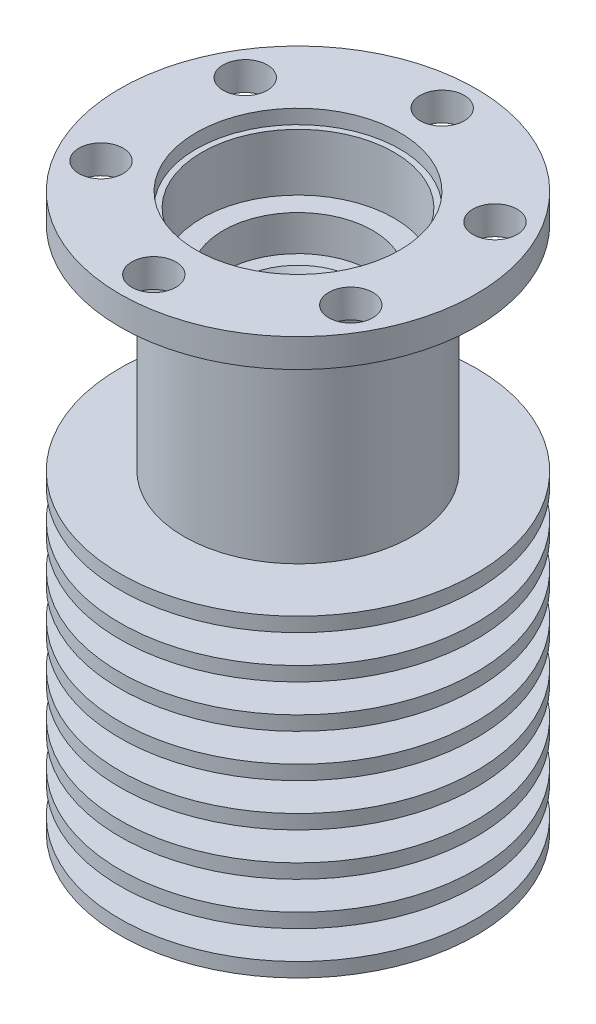
ISO-10303-21;
HEADER;
FILE_DESCRIPTION(('STEP AP214'),'2;1');
FILE_NAME('part.step','',(''),(''),'','','');
FILE_SCHEMA(('AUTOMOTIVE_DESIGN { 1 0 10303 214 1 1 1 1 }'));
ENDSEC;
DATA;
#1=APPLICATION_CONTEXT('core data for automotive mechanical design processes');
#2=APPLICATION_PROTOCOL_DEFINITION('international standard','automotive_design',2000,#1);
#3=PRODUCT_CONTEXT('',#1,'mechanical');
#4=PRODUCT('Part','Part','',(#3));
#5=PRODUCT_RELATED_PRODUCT_CATEGORY('part','',(#4));
#6=PRODUCT_DEFINITION_FORMATION('','',#4);
#7=PRODUCT_DEFINITION_CONTEXT('part definition',#1,'design');
#8=PRODUCT_DEFINITION('design','',#6,#7);
#9=PRODUCT_DEFINITION_SHAPE('','',#8);
#10=(LENGTH_UNIT() NAMED_UNIT(*) SI_UNIT(.MILLI.,.METRE.));
#11=(NAMED_UNIT(*) PLANE_ANGLE_UNIT() SI_UNIT($,.RADIAN.));
#12=(NAMED_UNIT(*) SI_UNIT($,.STERADIAN.) SOLID_ANGLE_UNIT());
#13=UNCERTAINTY_MEASURE_WITH_UNIT(LENGTH_MEASURE(1.E-05),#10,'distance_accuracy_value','');
#14=(GEOMETRIC_REPRESENTATION_CONTEXT(3) GLOBAL_UNCERTAINTY_ASSIGNED_CONTEXT((#13)) GLOBAL_UNIT_ASSIGNED_CONTEXT((#10,
#11,#12)) REPRESENTATION_CONTEXT('',''));
#15=CARTESIAN_POINT('',(0.,0.,0.));
#16=DIRECTION('',(0.,0.,1.));
#17=DIRECTION('',(1.,0.,0.));
#18=AXIS2_PLACEMENT_3D('',#15,#16,#17);
#19=CARTESIAN_POINT('',(0.,0.,0.));
#20=DIRECTION('',(0.,-1.,0.));
#21=DIRECTION('',(0.,0.,-1.));
#22=AXIS2_PLACEMENT_3D('',#19,#20,#21);
#23=CYLINDRICAL_SURFACE('',#22,6.75);
#24=CARTESIAN_POINT('',(0.,34.,0.));
#25=DIRECTION('',(0.,-1.,0.));
#26=DIRECTION('',(0.,0.,-1.));
#27=AXIS2_PLACEMENT_3D('',#24,#25,#26);
#28=CIRCLE('',#27,6.75);
#29=CARTESIAN_POINT('',(0.,34.,-6.75));
#30=VERTEX_POINT('',#29);
#31=EDGE_CURVE('E121',#30,#30,#28,.T.);
#32=ORIENTED_EDGE('',*,*,#31,.T.);
#33=EDGE_LOOP('',(#32));
#34=FACE_BOUND('',#33,.T.);
#35=CARTESIAN_POINT('',(0.,38.,0.));
#36=DIRECTION('',(0.,1.,0.));
#37=DIRECTION('',(-1.,0.,0.));
#38=AXIS2_PLACEMENT_3D('',#35,#36,#37);
#39=CIRCLE('',#38,6.75);
#40=CARTESIAN_POINT('',(-6.75,38.,0.));
#41=VERTEX_POINT('',#40);
#42=EDGE_CURVE('E57',#41,#41,#39,.F.);
#43=ORIENTED_EDGE('',*,*,#42,.F.);
#44=EDGE_LOOP('',(#43));
#45=FACE_BOUND('',#44,.T.);
#46=ADVANCED_FACE('F36',(#34,#45),#23,.F.);
#47=CARTESIAN_POINT('',(0.,39.,0.));
#48=DIRECTION('',(0.,1.,0.));
#49=DIRECTION('',(0.,0.,1.));
#50=AXIS2_PLACEMENT_3D('',#47,#48,#49);
#51=CYLINDRICAL_SURFACE('',#50,4.75);
#52=CARTESIAN_POINT('',(0.,21.,0.));
#53=DIRECTION('',(0.,-1.,0.));
#54=DIRECTION('',(0.,0.,-1.));
#55=AXIS2_PLACEMENT_3D('',#52,#53,#54);
#56=CIRCLE('',#55,4.75);
#57=CARTESIAN_POINT('',(0.,21.,-4.75));
#58=VERTEX_POINT('',#57);
#59=EDGE_CURVE('E178',#58,#58,#56,.T.);
#60=ORIENTED_EDGE('',*,*,#59,.T.);
#61=EDGE_LOOP('',(#60));
#62=FACE_BOUND('',#61,.T.);
#63=CARTESIAN_POINT('',(0.,19.,0.));
#64=DIRECTION('',(0.,-1.,0.));
#65=DIRECTION('',(0.,0.,-1.));
#66=AXIS2_PLACEMENT_3D('',#63,#64,#65);
#67=CIRCLE('',#66,4.75);
#68=CARTESIAN_POINT('',(0.,19.,-4.75));
#69=VERTEX_POINT('',#68);
#70=EDGE_CURVE('E67',#69,#69,#67,.T.);
#71=ORIENTED_EDGE('',*,*,#70,.F.);
#72=EDGE_LOOP('',(#71));
#73=FACE_BOUND('',#72,.T.);
#74=ADVANCED_FACE('F296',(#62,#73),#51,.T.);
#75=CARTESIAN_POINT('',(0.,18.,0.));
#76=DIRECTION('',(0.,-1.,0.));
#77=DIRECTION('',(0.,0.,-1.));
#78=AXIS2_PLACEMENT_3D('',#75,#76,#77);
#79=CIRCLE('',#78,4.75);
#80=CARTESIAN_POINT('',(0.,18.,-4.75));
#81=VERTEX_POINT('',#80);
#82=EDGE_CURVE('E162',#81,#81,#79,.T.);
#83=ORIENTED_EDGE('',*,*,#82,.T.);
#84=EDGE_LOOP('',(#83));
#85=FACE_BOUND('',#84,.T.);
#86=CARTESIAN_POINT('',(0.,16.,0.));
#87=DIRECTION('',(0.,-1.,0.));
#88=DIRECTION('',(0.,0.,-1.));
#89=AXIS2_PLACEMENT_3D('',#86,#87,#88);
#90=CIRCLE('',#89,4.75);
#91=CARTESIAN_POINT('',(0.,16.,-4.75));
#92=VERTEX_POINT('',#91);
#93=EDGE_CURVE('E147',#92,#92,#90,.T.);
#94=ORIENTED_EDGE('',*,*,#93,.F.);
#95=EDGE_LOOP('',(#94));
#96=FACE_BOUND('',#95,.T.);
#97=ADVANCED_FACE('F302',(#85,#96),#51,.T.);
#98=CARTESIAN_POINT('',(0.,15.,0.));
#99=DIRECTION('',(0.,-1.,0.));
#100=DIRECTION('',(0.,0.,-1.));
#101=AXIS2_PLACEMENT_3D('',#98,#99,#100);
#102=CIRCLE('',#101,4.75);
#103=CARTESIAN_POINT('',(0.,15.,-4.75));
#104=VERTEX_POINT('',#103);
#105=EDGE_CURVE('E151',#104,#104,#102,.T.);
#106=ORIENTED_EDGE('',*,*,#105,.T.);
#107=EDGE_LOOP('',(#106));
#108=FACE_BOUND('',#107,.T.);
#109=CARTESIAN_POINT('',(0.,13.,0.));
#110=DIRECTION('',(0.,-1.,0.));
#111=DIRECTION('',(0.,0.,-1.));
#112=AXIS2_PLACEMENT_3D('',#109,#110,#111);
#113=CIRCLE('',#112,4.75);
#114=CARTESIAN_POINT('',(0.,13.,-4.75));
#115=VERTEX_POINT('',#114);
#116=EDGE_CURVE('E71',#115,#115,#113,.T.);
#117=ORIENTED_EDGE('',*,*,#116,.F.);
#118=EDGE_LOOP('',(#117));
#119=FACE_BOUND('',#118,.T.);
#120=ADVANCED_FACE('F305',(#108,#119),#51,.T.);
#121=CARTESIAN_POINT('',(0.,39.,0.));
#122=DIRECTION('',(0.,1.,0.));
#123=DIRECTION('',(0.,0.,1.));
#124=AXIS2_PLACEMENT_3D('',#121,#122,#123);
#125=CYLINDRICAL_SURFACE('',#124,5.25);
#126=CARTESIAN_POINT('',(0.,12.,0.));
#127=DIRECTION('',(0.,1.,0.));
#128=DIRECTION('',(0.,0.,1.));
#129=AXIS2_PLACEMENT_3D('',#126,#127,#128);
#130=CIRCLE('',#129,5.25);
#131=CARTESIAN_POINT('',(0.,12.,5.25));
#132=VERTEX_POINT('',#131);
#133=EDGE_CURVE('E94',#132,#132,#130,.T.);
#134=ORIENTED_EDGE('',*,*,#133,.F.);
#135=EDGE_LOOP('',(#134));
#136=FACE_BOUND('',#135,.T.);
#137=CARTESIAN_POINT('',(0.,10.,0.));
#138=DIRECTION('',(0.,-1.,0.));
#139=DIRECTION('',(0.,0.,-1.));
#140=AXIS2_PLACEMENT_3D('',#137,#138,#139);
#141=CIRCLE('',#140,5.25);
#142=CARTESIAN_POINT('',(0.,10.,-5.25));
#143=VERTEX_POINT('',#142);
#144=EDGE_CURVE('E68',#143,#143,#141,.T.);
#145=ORIENTED_EDGE('',*,*,#144,.F.);
#146=EDGE_LOOP('',(#145));
#147=FACE_BOUND('',#146,.T.);
#148=ADVANCED_FACE('F346',(#136,#147),#125,.T.);
#149=CARTESIAN_POINT('',(0.,39.,0.));
#150=DIRECTION('',(0.,1.,0.));
#151=DIRECTION('',(0.,0.,1.));
#152=AXIS2_PLACEMENT_3D('',#149,#150,#151);
#153=CYLINDRICAL_SURFACE('',#152,6.);
#154=CARTESIAN_POINT('',(0.,9.,0.));
#155=DIRECTION('',(0.,1.,0.));
#156=DIRECTION('',(0.,0.,1.));
#157=AXIS2_PLACEMENT_3D('',#154,#155,#156);
#158=CIRCLE('',#157,6.);
#159=CARTESIAN_POINT('',(0.,9.,6.));
#160=VERTEX_POINT('',#159);
#161=EDGE_CURVE('E91',#160,#160,#158,.T.);
#162=ORIENTED_EDGE('',*,*,#161,.F.);
#163=EDGE_LOOP('',(#162));
#164=FACE_BOUND('',#163,.T.);
#165=CARTESIAN_POINT('',(0.,7.,0.));
#166=DIRECTION('',(0.,-1.,0.));
#167=DIRECTION('',(0.,0.,-1.));
#168=AXIS2_PLACEMENT_3D('',#165,#166,#167);
#169=CIRCLE('',#168,6.);
#170=CARTESIAN_POINT('',(0.,7.,-6.));
#171=VERTEX_POINT('',#170);
#172=EDGE_CURVE('E72',#171,#171,#169,.T.);
#173=ORIENTED_EDGE('',*,*,#172,.F.);
#174=EDGE_LOOP('',(#173));
#175=FACE_BOUND('',#174,.T.);
#176=ADVANCED_FACE('F350',(#164,#175),#153,.T.);
#177=CARTESIAN_POINT('',(0.,6.,0.));
#178=DIRECTION('',(0.,-1.,0.));
#179=DIRECTION('',(0.,0.,-1.));
#180=AXIS2_PLACEMENT_3D('',#177,#178,#179);
#181=CIRCLE('',#180,6.);
#182=CARTESIAN_POINT('',(0.,6.,-6.));
#183=VERTEX_POINT('',#182);
#184=EDGE_CURVE('E76',#183,#183,#181,.T.);
#185=ORIENTED_EDGE('',*,*,#184,.T.);
#186=EDGE_LOOP('',(#185));
#187=FACE_BOUND('',#186,.T.);
#188=CARTESIAN_POINT('',(0.,4.,0.));
#189=DIRECTION('',(0.,-1.,0.));
#190=DIRECTION('',(0.,0.,-1.));
#191=AXIS2_PLACEMENT_3D('',#188,#189,#190);
#192=CIRCLE('',#191,6.);
#193=CARTESIAN_POINT('',(0.,4.,-6.));
#194=VERTEX_POINT('',#193);
#195=EDGE_CURVE('E75',#194,#194,#192,.T.);
#196=ORIENTED_EDGE('',*,*,#195,.F.);
#197=EDGE_LOOP('',(#196));
#198=FACE_BOUND('',#197,.T.);
#199=ADVANCED_FACE('F354',(#187,#198),#153,.T.);
#200=CARTESIAN_POINT('',(0.,3.,0.));
#201=DIRECTION('',(0.,-1.,0.));
#202=DIRECTION('',(0.,0.,-1.));
#203=AXIS2_PLACEMENT_3D('',#200,#201,#202);
#204=CIRCLE('',#203,6.);
#205=CARTESIAN_POINT('',(0.,3.,-6.));
#206=VERTEX_POINT('',#205);
#207=EDGE_CURVE('E84',#206,#206,#204,.T.);
#208=ORIENTED_EDGE('',*,*,#207,.T.);
#209=EDGE_LOOP('',(#208));
#210=FACE_BOUND('',#209,.T.);
#211=CARTESIAN_POINT('',(0.,1.,0.));
#212=DIRECTION('',(0.,-1.,0.));
#213=DIRECTION('',(0.,0.,-1.));
#214=AXIS2_PLACEMENT_3D('',#211,#212,#213);
#215=CIRCLE('',#214,6.);
#216=CARTESIAN_POINT('',(0.,1.,-6.));
#217=VERTEX_POINT('',#216);
#218=EDGE_CURVE('E83',#217,#217,#215,.T.);
#219=ORIENTED_EDGE('',*,*,#218,.F.);
#220=EDGE_LOOP('',(#219));
#221=FACE_BOUND('',#220,.T.);
#222=ADVANCED_FACE('F273',(#210,#221),#153,.T.);
#223=CARTESIAN_POINT('',(0.,39.,0.));
#224=DIRECTION('',(0.,1.,0.));
#225=DIRECTION('',(0.,0.,1.));
#226=AXIS2_PLACEMENT_3D('',#223,#224,#225);
#227=CYLINDRICAL_SURFACE('',#226,8.);
#228=CARTESIAN_POINT('',(0.,37.,0.));
#229=DIRECTION('',(0.,1.,0.));
#230=DIRECTION('',(0.,0.,1.));
#231=AXIS2_PLACEMENT_3D('',#228,#229,#230);
#232=CIRCLE('',#231,8.);
#233=CARTESIAN_POINT('',(0.,37.,8.));
#234=VERTEX_POINT('',#233);
#235=EDGE_CURVE('E97',#234,#234,#232,.T.);
#236=ORIENTED_EDGE('',*,*,#235,.F.);
#237=EDGE_LOOP('',(#236));
#238=FACE_BOUND('',#237,.T.);
#239=CARTESIAN_POINT('',(0.,22.,0.));
#240=DIRECTION('',(0.,-1.,0.));
#241=DIRECTION('',(0.,0.,-1.));
#242=AXIS2_PLACEMENT_3D('',#239,#240,#241);
#243=CIRCLE('',#242,8.);
#244=CARTESIAN_POINT('',(0.,22.,-8.));
#245=VERTEX_POINT('',#244);
#246=EDGE_CURVE('E173',#245,#245,#243,.T.);
#247=ORIENTED_EDGE('',*,*,#246,.F.);
#248=EDGE_LOOP('',(#247));
#249=FACE_BOUND('',#248,.T.);
#250=ADVANCED_FACE('F266',(#238,#249),#227,.T.);
#251=CARTESIAN_POINT('',(8.,37.,0.));
#252=DIRECTION('',(0.,1.,0.));
#253=DIRECTION('',(0.,0.,1.));
#254=AXIS2_PLACEMENT_3D('',#251,#252,#253);
#255=PLANE('',#254);
#256=CARTESIAN_POINT('',(8.76850721331738,37.,-5.0625000000001));
#257=DIRECTION('',(0.,1.,0.));
#258=DIRECTION('',(0.,0.,1.));
#259=AXIS2_PLACEMENT_3D('',#256,#257,#258);
#260=CIRCLE('',#259,1.55);
#261=CARTESIAN_POINT('',(8.76850721331738,37.,-3.5125000000001));
#262=VERTEX_POINT('',#261);
#263=EDGE_CURVE('E215',#262,#262,#260,.F.);
#264=ORIENTED_EDGE('',*,*,#263,.F.);
#265=EDGE_LOOP('',(#264));
#266=FACE_BOUND('',#265,.T.);
#267=CARTESIAN_POINT('',(8.76850721331749,37.,5.06249999999992));
#268=DIRECTION('',(0.,1.,0.));
#269=DIRECTION('',(0.,0.,1.));
#270=AXIS2_PLACEMENT_3D('',#267,#268,#269);
#271=CIRCLE('',#270,1.55);
#272=CARTESIAN_POINT('',(8.76850721331749,37.,6.61249999999992));
#273=VERTEX_POINT('',#272);
#274=EDGE_CURVE('E209',#273,#273,#271,.F.);
#275=ORIENTED_EDGE('',*,*,#274,.F.);
#276=EDGE_LOOP('',(#275));
#277=FACE_BOUND('',#276,.T.);
#278=CARTESIAN_POINT('',(0.,37.,10.125));
#279=DIRECTION('',(0.,1.,0.));
#280=DIRECTION('',(0.,0.,1.));
#281=AXIS2_PLACEMENT_3D('',#278,#279,#280);
#282=CIRCLE('',#281,1.55);
#283=CARTESIAN_POINT('',(0.,37.,11.675));
#284=VERTEX_POINT('',#283);
#285=EDGE_CURVE('E203',#284,#284,#282,.F.);
#286=ORIENTED_EDGE('',*,*,#285,.F.);
#287=EDGE_LOOP('',(#286));
#288=FACE_BOUND('',#287,.T.);
#289=CARTESIAN_POINT('',(-8.76850721331742,37.,5.06250000000004));
#290=DIRECTION('',(0.,1.,0.));
#291=DIRECTION('',(0.,0.,1.));
#292=AXIS2_PLACEMENT_3D('',#289,#290,#291);
#293=CIRCLE('',#292,1.55);
#294=CARTESIAN_POINT('',(-8.76850721331742,37.,6.61250000000004));
#295=VERTEX_POINT('',#294);
#296=EDGE_CURVE('E197',#295,#295,#293,.F.);
#297=ORIENTED_EDGE('',*,*,#296,.F.);
#298=EDGE_LOOP('',(#297));
#299=FACE_BOUND('',#298,.T.);
#300=CARTESIAN_POINT('',(-8.76850721331745,37.,-5.06249999999998));
#301=DIRECTION('',(0.,1.,0.));
#302=DIRECTION('',(0.,0.,1.));
#303=AXIS2_PLACEMENT_3D('',#300,#301,#302);
#304=CIRCLE('',#303,1.55);
#305=CARTESIAN_POINT('',(-8.76850721331745,37.,-3.51249999999998));
#306=VERTEX_POINT('',#305);
#307=EDGE_CURVE('E191',#306,#306,#304,.F.);
#308=ORIENTED_EDGE('',*,*,#307,.F.);
#309=EDGE_LOOP('',(#308));
#310=FACE_BOUND('',#309,.T.);
#311=CARTESIAN_POINT('',(0.,37.,-10.125));
#312=DIRECTION('',(0.,1.,0.));
#313=DIRECTION('',(0.,0.,1.));
#314=AXIS2_PLACEMENT_3D('',#311,#312,#313);
#315=CIRCLE('',#314,1.55);
#316=CARTESIAN_POINT('',(0.,37.,-8.575));
#317=VERTEX_POINT('',#316);
#318=EDGE_CURVE('E185',#317,#317,#315,.F.);
#319=ORIENTED_EDGE('',*,*,#318,.F.);
#320=EDGE_LOOP('',(#319));
#321=FACE_BOUND('',#320,.T.);
#322=CARTESIAN_POINT('',(0.,37.,0.));
#323=DIRECTION('',(0.,1.,0.));
#324=DIRECTION('',(0.,0.,1.));
#325=AXIS2_PLACEMENT_3D('',#322,#323,#324);
#326=CIRCLE('',#325,12.5);
#327=CARTESIAN_POINT('',(0.,37.,12.5));
#328=VERTEX_POINT('',#327);
#329=EDGE_CURVE('E100',#328,#328,#326,.T.);
#330=ORIENTED_EDGE('',*,*,#329,.F.);
#331=EDGE_LOOP('',(#330));
#332=FACE_BOUND('',#331,.T.);
#333=ORIENTED_EDGE('',*,*,#235,.T.);
#334=EDGE_LOOP('',(#333));
#335=FACE_BOUND('',#334,.T.);
#336=ADVANCED_FACE('F260',(#266,#277,#288,#299,#310,#321,#332,#335),#255,.F.);
#337=CARTESIAN_POINT('',(0.,39.,0.));
#338=DIRECTION('',(0.,1.,0.));
#339=DIRECTION('',(0.,0.,1.));
#340=AXIS2_PLACEMENT_3D('',#337,#338,#339);
#341=CYLINDRICAL_SURFACE('',#340,12.5);
#342=CARTESIAN_POINT('',(0.,39.,0.));
#343=DIRECTION('',(0.,1.,0.));
#344=DIRECTION('',(0.,0.,1.));
#345=AXIS2_PLACEMENT_3D('',#342,#343,#344);
#346=CIRCLE('',#345,12.5);
#347=CARTESIAN_POINT('',(0.,39.,12.5));
#348=VERTEX_POINT('',#347);
#349=EDGE_CURVE('E103',#348,#348,#346,.T.);
#350=ORIENTED_EDGE('',*,*,#349,.F.);
#351=EDGE_LOOP('',(#350));
#352=FACE_BOUND('',#351,.T.);
#353=ORIENTED_EDGE('',*,*,#329,.T.);
#354=EDGE_LOOP('',(#353));
#355=FACE_BOUND('',#354,.T.);
#356=ADVANCED_FACE('F242',(#352,#355),#341,.T.);
#357=CARTESIAN_POINT('',(12.5,39.,0.));
#358=DIRECTION('',(0.,-1.,0.));
#359=DIRECTION('',(0.,0.,-1.));
#360=AXIS2_PLACEMENT_3D('',#357,#358,#359);
#361=PLANE('',#360);
#362=CARTESIAN_POINT('',(0.,39.,0.));
#363=DIRECTION('',(0.,1.,0.));
#364=DIRECTION('',(-1.,0.,0.));
#365=AXIS2_PLACEMENT_3D('',#362,#363,#364);
#366=CIRCLE('',#365,7.15);
#367=CARTESIAN_POINT('',(-7.15,39.,0.));
#368=VERTEX_POINT('',#367);
#369=EDGE_CURVE('E222',#368,#368,#366,.T.);
#370=ORIENTED_EDGE('',*,*,#369,.F.);
#371=EDGE_LOOP('',(#370));
#372=FACE_BOUND('',#371,.T.);
#373=CARTESIAN_POINT('',(8.76850721331738,39.,-5.0625000000001));
#374=DIRECTION('',(0.,1.,0.));
#375=DIRECTION('',(-0.50000000000001,0.,-0.866025403784433));
#376=AXIS2_PLACEMENT_3D('',#373,#374,#375);
#377=CIRCLE('',#376,1.55);
#378=CARTESIAN_POINT('',(7.99350721331737,39.,-6.40483937586597));
#379=VERTEX_POINT('',#378);
#380=EDGE_CURVE('E60',#379,#379,#377,.T.);
#381=ORIENTED_EDGE('',*,*,#380,.F.);
#382=EDGE_LOOP('',(#381));
#383=FACE_BOUND('',#382,.T.);
#384=CARTESIAN_POINT('',(8.76850721331749,39.,5.06249999999992));
#385=DIRECTION('',(0.,1.,0.));
#386=DIRECTION('',(0.499999999999992,0.,-0.866025403784443));
#387=AXIS2_PLACEMENT_3D('',#384,#385,#386);
#388=CIRCLE('',#387,1.55);
#389=CARTESIAN_POINT('',(9.54350721331748,39.,3.72016062413403));
#390=VERTEX_POINT('',#389);
#391=EDGE_CURVE('E212',#390,#390,#388,.T.);
#392=ORIENTED_EDGE('',*,*,#391,.F.);
#393=EDGE_LOOP('',(#392));
#394=FACE_BOUND('',#393,.T.);
#395=CARTESIAN_POINT('',(0.,39.,10.125));
#396=DIRECTION('',(0.,1.,0.));
#397=DIRECTION('',(1.,0.,0.));
#398=AXIS2_PLACEMENT_3D('',#395,#396,#397);
#399=CIRCLE('',#398,1.55);
#400=CARTESIAN_POINT('',(1.55,39.,10.125));
#401=VERTEX_POINT('',#400);
#402=EDGE_CURVE('E206',#401,#401,#399,.T.);
#403=ORIENTED_EDGE('',*,*,#402,.F.);
#404=EDGE_LOOP('',(#403));
#405=FACE_BOUND('',#404,.T.);
#406=CARTESIAN_POINT('',(-8.76850721331742,39.,5.06250000000004));
#407=DIRECTION('',(0.,1.,0.));
#408=DIRECTION('',(0.500000000000004,0.,0.866025403784436));
#409=AXIS2_PLACEMENT_3D('',#406,#407,#408);
#410=CIRCLE('',#409,1.55);
#411=CARTESIAN_POINT('',(-7.99350721331741,39.,6.40483937586592));
#412=VERTEX_POINT('',#411);
#413=EDGE_CURVE('E200',#412,#412,#410,.T.);
#414=ORIENTED_EDGE('',*,*,#413,.F.);
#415=EDGE_LOOP('',(#414));
#416=FACE_BOUND('',#415,.T.);
#417=CARTESIAN_POINT('',(-8.76850721331745,39.,-5.06249999999998));
#418=DIRECTION('',(0.,1.,0.));
#419=DIRECTION('',(-0.499999999999998,0.,0.86602540378444));
#420=AXIS2_PLACEMENT_3D('',#417,#418,#419);
#421=CIRCLE('',#420,1.55);
#422=CARTESIAN_POINT('',(-9.54350721331745,39.,-3.7201606241341));
#423=VERTEX_POINT('',#422);
#424=EDGE_CURVE('E194',#423,#423,#421,.T.);
#425=ORIENTED_EDGE('',*,*,#424,.F.);
#426=EDGE_LOOP('',(#425));
#427=FACE_BOUND('',#426,.T.);
#428=CARTESIAN_POINT('',(0.,39.,-10.125));
#429=DIRECTION('',(0.,1.,0.));
#430=DIRECTION('',(-1.,0.,0.));
#431=AXIS2_PLACEMENT_3D('',#428,#429,#430);
#432=CIRCLE('',#431,1.55);
#433=CARTESIAN_POINT('',(-1.55,39.,-10.125));
#434=VERTEX_POINT('',#433);
#435=EDGE_CURVE('E188',#434,#434,#432,.T.);
#436=ORIENTED_EDGE('',*,*,#435,.F.);
#437=EDGE_LOOP('',(#436));
#438=FACE_BOUND('',#437,.T.);
#439=ORIENTED_EDGE('',*,*,#349,.T.);
#440=EDGE_LOOP('',(#439));
#441=FACE_BOUND('',#440,.T.);
#442=ADVANCED_FACE('F238',(#372,#383,#394,#405,#416,#427,#438,#441),#361,.F.);
#443=CARTESIAN_POINT('',(0.,0.,0.));
#444=DIRECTION('',(0.,1.,0.));
#445=DIRECTION('',(0.,0.,1.));
#446=AXIS2_PLACEMENT_3D('',#443,#444,#445);
#447=PLANE('',#446);
#448=CARTESIAN_POINT('',(0.,0.,0.));
#449=DIRECTION('',(0.,-1.,0.));
#450=DIRECTION('',(0.,0.,-1.));
#451=AXIS2_PLACEMENT_3D('',#448,#449,#450);
#452=CIRCLE('',#451,2.5);
#453=CARTESIAN_POINT('',(0.,0.,-2.5));
#454=VERTEX_POINT('',#453);
#455=EDGE_CURVE('E106',#454,#454,#452,.T.);
#456=ORIENTED_EDGE('',*,*,#455,.F.);
#457=EDGE_LOOP('',(#456));
#458=FACE_BOUND('',#457,.T.);
#459=CARTESIAN_POINT('',(0.,0.,0.));
#460=DIRECTION('',(0.,-1.,0.));
#461=DIRECTION('',(0.,0.,-1.));
#462=AXIS2_PLACEMENT_3D('',#459,#460,#461);
#463=CIRCLE('',#462,12.5);
#464=CARTESIAN_POINT('',(0.,0.,-12.5));
#465=VERTEX_POINT('',#464);
#466=EDGE_CURVE('E87',#465,#465,#463,.T.);
#467=ORIENTED_EDGE('',*,*,#466,.T.);
#468=EDGE_LOOP('',(#467));
#469=FACE_BOUND('',#468,.T.);
#470=ADVANCED_FACE('F241',(#458,#469),#447,.F.);
#471=CARTESIAN_POINT('',(0.,0.,0.));
#472=DIRECTION('',(0.,-1.,0.));
#473=DIRECTION('',(0.,0.,-1.));
#474=AXIS2_PLACEMENT_3D('',#471,#472,#473);
#475=CYLINDRICAL_SURFACE('',#474,2.5);
#476=CARTESIAN_POINT('',(0.,9.,0.));
#477=DIRECTION('',(0.,-1.,0.));
#478=DIRECTION('',(0.,0.,-1.));
#479=AXIS2_PLACEMENT_3D('',#476,#477,#478);
#480=CIRCLE('',#479,2.5);
#481=CARTESIAN_POINT('',(0.,9.,-2.5));
#482=VERTEX_POINT('',#481);
#483=EDGE_CURVE('E109',#482,#482,#480,.T.);
#484=ORIENTED_EDGE('',*,*,#483,.F.);
#485=EDGE_LOOP('',(#484));
#486=FACE_BOUND('',#485,.T.);
#487=ORIENTED_EDGE('',*,*,#455,.T.);
#488=EDGE_LOOP('',(#487));
#489=FACE_BOUND('',#488,.T.);
#490=ADVANCED_FACE('F337',(#486,#489),#475,.F.);
#491=CARTESIAN_POINT('',(2.5,9.,0.));
#492=DIRECTION('',(0.,1.,0.));
#493=DIRECTION('',(0.,0.,1.));
#494=AXIS2_PLACEMENT_3D('',#491,#492,#493);
#495=PLANE('',#494);
#496=CARTESIAN_POINT('',(0.,9.,0.));
#497=DIRECTION('',(0.,1.,0.));
#498=DIRECTION('',(0.,0.,1.));
#499=AXIS2_PLACEMENT_3D('',#496,#497,#498);
#500=CIRCLE('',#499,1.85000000000001);
#501=CARTESIAN_POINT('',(0.,9.,1.85000000000001));
#502=VERTEX_POINT('',#501);
#503=EDGE_CURVE('E47',#502,#502,#500,.T.);
#504=ORIENTED_EDGE('',*,*,#503,.T.);
#505=EDGE_LOOP('',(#504));
#506=FACE_BOUND('',#505,.T.);
#507=ORIENTED_EDGE('',*,*,#483,.T.);
#508=EDGE_LOOP('',(#507));
#509=FACE_BOUND('',#508,.T.);
#510=ADVANCED_FACE('F333',(#506,#509),#495,.F.);
#511=CARTESIAN_POINT('',(0.,0.,0.));
#512=DIRECTION('',(0.,-1.,0.));
#513=DIRECTION('',(0.,0.,-1.));
#514=AXIS2_PLACEMENT_3D('',#511,#512,#513);
#515=CYLINDRICAL_SURFACE('',#514,1.7);
#516=CARTESIAN_POINT('',(0.,9.25980762113535,0.));
#517=DIRECTION('',(0.,1.,0.));
#518=DIRECTION('',(0.,0.,1.));
#519=AXIS2_PLACEMENT_3D('',#516,#517,#518);
#520=CIRCLE('',#519,1.7);
#521=CARTESIAN_POINT('',(0.,9.25980762113535,1.7));
#522=VERTEX_POINT('',#521);
#523=EDGE_CURVE('E51',#522,#522,#520,.F.);
#524=ORIENTED_EDGE('',*,*,#523,.T.);
#525=EDGE_LOOP('',(#524));
#526=FACE_BOUND('',#525,.T.);
#527=CARTESIAN_POINT('',(0.,10.4803847577294,0.));
#528=DIRECTION('',(0.,-1.,0.));
#529=DIRECTION('',(0.,0.,-1.));
#530=AXIS2_PLACEMENT_3D('',#527,#528,#529);
#531=CIRCLE('',#530,1.7);
#532=CARTESIAN_POINT('',(0.,10.4803847577294,-1.7));
#533=VERTEX_POINT('',#532);
#534=EDGE_CURVE('E56',#533,#533,#531,.F.);
#535=ORIENTED_EDGE('',*,*,#534,.T.);
#536=EDGE_LOOP('',(#535));
#537=FACE_BOUND('',#536,.T.);
#538=ADVANCED_FACE('F329',(#526,#537),#515,.F.);
#539=CARTESIAN_POINT('',(1.7,11.,0.));
#540=DIRECTION('',(0.,-1.,0.));
#541=DIRECTION('',(0.,0.,-1.));
#542=AXIS2_PLACEMENT_3D('',#539,#540,#541);
#543=PLANE('',#542);
#544=CARTESIAN_POINT('',(0.,11.,0.));
#545=DIRECTION('',(0.,-1.,0.));
#546=DIRECTION('',(0.,0.,-1.));
#547=AXIS2_PLACEMENT_3D('',#544,#545,#546);
#548=CIRCLE('',#547,1.99999999999999);
#549=CARTESIAN_POINT('',(0.,11.,-1.99999999999999));
#550=VERTEX_POINT('',#549);
#551=EDGE_CURVE('E64',#550,#550,#548,.T.);
#552=ORIENTED_EDGE('',*,*,#551,.T.);
#553=EDGE_LOOP('',(#552));
#554=FACE_BOUND('',#553,.T.);
#555=CARTESIAN_POINT('',(0.,11.,0.));
#556=DIRECTION('',(0.,-1.,0.));
#557=DIRECTION('',(0.,0.,-1.));
#558=AXIS2_PLACEMENT_3D('',#555,#556,#557);
#559=CIRCLE('',#558,3.25);
#560=CARTESIAN_POINT('',(0.,11.,-3.25));
#561=VERTEX_POINT('',#560);
#562=EDGE_CURVE('E112',#561,#561,#559,.T.);
#563=ORIENTED_EDGE('',*,*,#562,.F.);
#564=EDGE_LOOP('',(#563));
#565=FACE_BOUND('',#564,.T.);
#566=ADVANCED_FACE('F326',(#554,#565),#543,.F.);
#567=CARTESIAN_POINT('',(0.,0.,0.));
#568=DIRECTION('',(0.,-1.,0.));
#569=DIRECTION('',(0.,0.,-1.));
#570=AXIS2_PLACEMENT_3D('',#567,#568,#569);
#571=CYLINDRICAL_SURFACE('',#570,3.25);
#572=CARTESIAN_POINT('',(0.,29.7679491924311,0.));
#573=DIRECTION('',(0.,-1.,0.));
#574=DIRECTION('',(0.,0.,-1.));
#575=AXIS2_PLACEMENT_3D('',#572,#573,#574);
#576=CIRCLE('',#575,3.25);
#577=CARTESIAN_POINT('',(0.,29.7679491924311,-3.25));
#578=VERTEX_POINT('',#577);
#579=EDGE_CURVE('E10',#578,#578,#576,.F.);
#580=ORIENTED_EDGE('',*,*,#579,.T.);
#581=EDGE_LOOP('',(#580));
#582=FACE_BOUND('',#581,.T.);
#583=ORIENTED_EDGE('',*,*,#562,.T.);
#584=EDGE_LOOP('',(#583));
#585=FACE_BOUND('',#584,.T.);
#586=ADVANCED_FACE('F323',(#582,#585),#571,.F.);
#587=CARTESIAN_POINT('',(3.25,31.5,0.));
#588=DIRECTION('',(0.,-1.,0.));
#589=DIRECTION('',(0.,0.,-1.));
#590=AXIS2_PLACEMENT_3D('',#587,#588,#589);
#591=PLANE('',#590);
#592=CARTESIAN_POINT('',(0.,31.5,0.));
#593=DIRECTION('',(0.,-1.,0.));
#594=DIRECTION('',(0.,0.,-1.));
#595=AXIS2_PLACEMENT_3D('',#592,#593,#594);
#596=CIRCLE('',#595,4.25000000000002);
#597=CARTESIAN_POINT('',(0.,31.5,-4.25000000000002));
#598=VERTEX_POINT('',#597);
#599=EDGE_CURVE('E43',#598,#598,#596,.T.);
#600=ORIENTED_EDGE('',*,*,#599,.T.);
#601=EDGE_LOOP('',(#600));
#602=FACE_BOUND('',#601,.T.);
#603=CARTESIAN_POINT('',(0.,31.5,0.));
#604=DIRECTION('',(0.,-1.,0.));
#605=DIRECTION('',(0.,0.,-1.));
#606=AXIS2_PLACEMENT_3D('',#603,#604,#605);
#607=CIRCLE('',#606,5.25);
#608=CARTESIAN_POINT('',(0.,31.5,-5.25));
#609=VERTEX_POINT('',#608);
#610=EDGE_CURVE('E115',#609,#609,#607,.T.);
#611=ORIENTED_EDGE('',*,*,#610,.F.);
#612=EDGE_LOOP('',(#611));
#613=FACE_BOUND('',#612,.T.);
#614=ADVANCED_FACE('F319',(#602,#613),#591,.F.);
#615=CARTESIAN_POINT('',(0.,0.,0.));
#616=DIRECTION('',(0.,-1.,0.));
#617=DIRECTION('',(0.,0.,-1.));
#618=AXIS2_PLACEMENT_3D('',#615,#616,#617);
#619=CYLINDRICAL_SURFACE('',#618,5.25);
#620=CARTESIAN_POINT('',(0.,34.,0.));
#621=DIRECTION('',(0.,-1.,0.));
#622=DIRECTION('',(0.,0.,-1.));
#623=AXIS2_PLACEMENT_3D('',#620,#621,#622);
#624=CIRCLE('',#623,5.25);
#625=CARTESIAN_POINT('',(0.,34.,-5.25));
#626=VERTEX_POINT('',#625);
#627=EDGE_CURVE('E118',#626,#626,#624,.T.);
#628=ORIENTED_EDGE('',*,*,#627,.F.);
#629=EDGE_LOOP('',(#628));
#630=FACE_BOUND('',#629,.T.);
#631=ORIENTED_EDGE('',*,*,#610,.T.);
#632=EDGE_LOOP('',(#631));
#633=FACE_BOUND('',#632,.T.);
#634=ADVANCED_FACE('F315',(#630,#633),#619,.F.);
#635=CARTESIAN_POINT('',(5.25,34.,0.));
#636=DIRECTION('',(0.,-1.,0.));
#637=DIRECTION('',(0.,0.,-1.));
#638=AXIS2_PLACEMENT_3D('',#635,#636,#637);
#639=PLANE('',#638);
#640=ORIENTED_EDGE('',*,*,#31,.F.);
#641=EDGE_LOOP('',(#640));
#642=FACE_BOUND('',#641,.T.);
#643=ORIENTED_EDGE('',*,*,#627,.T.);
#644=EDGE_LOOP('',(#643));
#645=FACE_BOUND('',#644,.T.);
#646=ADVANCED_FACE('F311',(#642,#645),#639,.F.);
#647=CARTESIAN_POINT('',(0.,1.,0.));
#648=DIRECTION('',(0.,-1.,0.));
#649=DIRECTION('',(0.,0.,-1.));
#650=AXIS2_PLACEMENT_3D('',#647,#648,#649);
#651=PLANE('',#650);
#652=CARTESIAN_POINT('',(0.,1.,0.));
#653=DIRECTION('',(0.,-1.,0.));
#654=DIRECTION('',(0.,0.,-1.));
#655=AXIS2_PLACEMENT_3D('',#652,#653,#654);
#656=CIRCLE('',#655,12.5);
#657=CARTESIAN_POINT('',(0.,1.,-12.5));
#658=VERTEX_POINT('',#657);
#659=EDGE_CURVE('E124',#658,#658,#656,.T.);
#660=ORIENTED_EDGE('',*,*,#659,.F.);
#661=EDGE_LOOP('',(#660));
#662=FACE_BOUND('',#661,.T.);
#663=ORIENTED_EDGE('',*,*,#218,.T.);
#664=EDGE_LOOP('',(#663));
#665=FACE_BOUND('',#664,.T.);
#666=ADVANCED_FACE('F314',(#662,#665),#651,.F.);
#667=CARTESIAN_POINT('',(0.,1.,0.));
#668=DIRECTION('',(0.,-1.,0.));
#669=DIRECTION('',(0.,0.,-1.));
#670=AXIS2_PLACEMENT_3D('',#667,#668,#669);
#671=CYLINDRICAL_SURFACE('',#670,12.5);
#672=ORIENTED_EDGE('',*,*,#659,.T.);
#673=EDGE_LOOP('',(#672));
#674=FACE_BOUND('',#673,.T.);
#675=ORIENTED_EDGE('',*,*,#466,.F.);
#676=EDGE_LOOP('',(#675));
#677=FACE_BOUND('',#676,.T.);
#678=ADVANCED_FACE('F309',(#674,#677),#671,.T.);
#679=CARTESIAN_POINT('',(0.,4.,0.));
#680=DIRECTION('',(0.,-1.,0.));
#681=DIRECTION('',(0.,0.,-1.));
#682=AXIS2_PLACEMENT_3D('',#679,#680,#681);
#683=PLANE('',#682);
#684=CARTESIAN_POINT('',(0.,4.,0.));
#685=DIRECTION('',(0.,-1.,0.));
#686=DIRECTION('',(0.,0.,-1.));
#687=AXIS2_PLACEMENT_3D('',#684,#685,#686);
#688=CIRCLE('',#687,12.5);
#689=CARTESIAN_POINT('',(0.,4.,-12.5));
#690=VERTEX_POINT('',#689);
#691=EDGE_CURVE('E88',#690,#690,#688,.T.);
#692=ORIENTED_EDGE('',*,*,#691,.F.);
#693=EDGE_LOOP('',(#692));
#694=FACE_BOUND('',#693,.T.);
#695=ORIENTED_EDGE('',*,*,#195,.T.);
#696=EDGE_LOOP('',(#695));
#697=FACE_BOUND('',#696,.T.);
#698=ADVANCED_FACE('F384',(#694,#697),#683,.F.);
#699=CARTESIAN_POINT('',(0.,3.,0.));
#700=DIRECTION('',(0.,-1.,0.));
#701=DIRECTION('',(0.,0.,-1.));
#702=AXIS2_PLACEMENT_3D('',#699,#700,#701);
#703=PLANE('',#702);
#704=CARTESIAN_POINT('',(0.,3.,0.));
#705=DIRECTION('',(0.,-1.,0.));
#706=DIRECTION('',(0.,0.,-1.));
#707=AXIS2_PLACEMENT_3D('',#704,#705,#706);
#708=CIRCLE('',#707,12.5);
#709=CARTESIAN_POINT('',(0.,3.,-12.5));
#710=VERTEX_POINT('',#709);
#711=EDGE_CURVE('E79',#710,#710,#708,.T.);
#712=ORIENTED_EDGE('',*,*,#711,.T.);
#713=EDGE_LOOP('',(#712));
#714=FACE_BOUND('',#713,.T.);
#715=ORIENTED_EDGE('',*,*,#207,.F.);
#716=EDGE_LOOP('',(#715));
#717=FACE_BOUND('',#716,.T.);
#718=ADVANCED_FACE('F390',(#714,#717),#703,.T.);
#719=CARTESIAN_POINT('',(0.,4.,0.));
#720=DIRECTION('',(0.,-1.,0.));
#721=DIRECTION('',(0.,0.,-1.));
#722=AXIS2_PLACEMENT_3D('',#719,#720,#721);
#723=CYLINDRICAL_SURFACE('',#722,12.5);
#724=ORIENTED_EDGE('',*,*,#691,.T.);
#725=EDGE_LOOP('',(#724));
#726=FACE_BOUND('',#725,.T.);
#727=ORIENTED_EDGE('',*,*,#711,.F.);
#728=EDGE_LOOP('',(#727));
#729=FACE_BOUND('',#728,.T.);
#730=ADVANCED_FACE('F401',(#726,#729),#723,.T.);
#731=CARTESIAN_POINT('',(0.,7.,0.));
#732=DIRECTION('',(0.,-1.,0.));
#733=DIRECTION('',(0.,0.,-1.));
#734=AXIS2_PLACEMENT_3D('',#731,#732,#733);
#735=PLANE('',#734);
#736=CARTESIAN_POINT('',(0.,7.,0.));
#737=DIRECTION('',(0.,-1.,0.));
#738=DIRECTION('',(0.,0.,-1.));
#739=AXIS2_PLACEMENT_3D('',#736,#737,#738);
#740=CIRCLE('',#739,12.5);
#741=CARTESIAN_POINT('',(0.,7.,-12.5));
#742=VERTEX_POINT('',#741);
#743=EDGE_CURVE('E80',#742,#742,#740,.T.);
#744=ORIENTED_EDGE('',*,*,#743,.F.);
#745=EDGE_LOOP('',(#744));
#746=FACE_BOUND('',#745,.T.);
#747=ORIENTED_EDGE('',*,*,#172,.T.);
#748=EDGE_LOOP('',(#747));
#749=FACE_BOUND('',#748,.T.);
#750=ADVANCED_FACE('F404',(#746,#749),#735,.F.);
#751=CARTESIAN_POINT('',(0.,6.,0.));
#752=DIRECTION('',(0.,-1.,0.));
#753=DIRECTION('',(0.,0.,-1.));
#754=AXIS2_PLACEMENT_3D('',#751,#752,#753);
#755=PLANE('',#754);
#756=CARTESIAN_POINT('',(0.,6.,0.));
#757=DIRECTION('',(0.,-1.,0.));
#758=DIRECTION('',(0.,0.,-1.));
#759=AXIS2_PLACEMENT_3D('',#756,#757,#758);
#760=CIRCLE('',#759,12.5);
#761=CARTESIAN_POINT('',(0.,6.,-12.5));
#762=VERTEX_POINT('',#761);
#763=EDGE_CURVE('E133',#762,#762,#760,.T.);
#764=ORIENTED_EDGE('',*,*,#763,.T.);
#765=EDGE_LOOP('',(#764));
#766=FACE_BOUND('',#765,.T.);
#767=ORIENTED_EDGE('',*,*,#184,.F.);
#768=EDGE_LOOP('',(#767));
#769=FACE_BOUND('',#768,.T.);
#770=ADVANCED_FACE('F413',(#766,#769),#755,.T.);
#771=CARTESIAN_POINT('',(0.,7.,0.));
#772=DIRECTION('',(0.,-1.,0.));
#773=DIRECTION('',(0.,0.,-1.));
#774=AXIS2_PLACEMENT_3D('',#771,#772,#773);
#775=CYLINDRICAL_SURFACE('',#774,12.5);
#776=ORIENTED_EDGE('',*,*,#743,.T.);
#777=EDGE_LOOP('',(#776));
#778=FACE_BOUND('',#777,.T.);
#779=ORIENTED_EDGE('',*,*,#763,.F.);
#780=EDGE_LOOP('',(#779));
#781=FACE_BOUND('',#780,.T.);
#782=ADVANCED_FACE('F409',(#778,#781),#775,.T.);
#783=CARTESIAN_POINT('',(0.,10.,0.));
#784=DIRECTION('',(0.,-1.,0.));
#785=DIRECTION('',(0.,0.,-1.));
#786=AXIS2_PLACEMENT_3D('',#783,#784,#785);
#787=PLANE('',#786);
#788=CARTESIAN_POINT('',(0.,10.,0.));
#789=DIRECTION('',(0.,-1.,0.));
#790=DIRECTION('',(0.,0.,-1.));
#791=AXIS2_PLACEMENT_3D('',#788,#789,#790);
#792=CIRCLE('',#791,12.5);
#793=CARTESIAN_POINT('',(0.,10.,-12.5));
#794=VERTEX_POINT('',#793);
#795=EDGE_CURVE('E136',#794,#794,#792,.T.);
#796=ORIENTED_EDGE('',*,*,#795,.F.);
#797=EDGE_LOOP('',(#796));
#798=FACE_BOUND('',#797,.T.);
#799=ORIENTED_EDGE('',*,*,#144,.T.);
#800=EDGE_LOOP('',(#799));
#801=FACE_BOUND('',#800,.T.);
#802=ADVANCED_FACE('F412',(#798,#801),#787,.F.);
#803=CARTESIAN_POINT('',(0.,9.,0.));
#804=DIRECTION('',(0.,-1.,0.));
#805=DIRECTION('',(0.,0.,-1.));
#806=AXIS2_PLACEMENT_3D('',#803,#804,#805);
#807=PLANE('',#806);
#808=CARTESIAN_POINT('',(0.,9.,0.));
#809=DIRECTION('',(0.,-1.,0.));
#810=DIRECTION('',(0.,0.,-1.));
#811=AXIS2_PLACEMENT_3D('',#808,#809,#810);
#812=CIRCLE('',#811,12.5);
#813=CARTESIAN_POINT('',(0.,9.,-12.5));
#814=VERTEX_POINT('',#813);
#815=EDGE_CURVE('E139',#814,#814,#812,.T.);
#816=ORIENTED_EDGE('',*,*,#815,.T.);
#817=EDGE_LOOP('',(#816));
#818=FACE_BOUND('',#817,.T.);
#819=ORIENTED_EDGE('',*,*,#161,.T.);
#820=EDGE_LOOP('',(#819));
#821=FACE_BOUND('',#820,.T.);
#822=ADVANCED_FACE('F425',(#818,#821),#807,.T.);
#823=CARTESIAN_POINT('',(0.,10.,0.));
#824=DIRECTION('',(0.,-1.,0.));
#825=DIRECTION('',(0.,0.,-1.));
#826=AXIS2_PLACEMENT_3D('',#823,#824,#825);
#827=CYLINDRICAL_SURFACE('',#826,12.5);
#828=ORIENTED_EDGE('',*,*,#795,.T.);
#829=EDGE_LOOP('',(#828));
#830=FACE_BOUND('',#829,.T.);
#831=ORIENTED_EDGE('',*,*,#815,.F.);
#832=EDGE_LOOP('',(#831));
#833=FACE_BOUND('',#832,.T.);
#834=ADVANCED_FACE('F421',(#830,#833),#827,.T.);
#835=CARTESIAN_POINT('',(0.,13.,0.));
#836=DIRECTION('',(0.,-1.,0.));
#837=DIRECTION('',(0.,0.,-1.));
#838=AXIS2_PLACEMENT_3D('',#835,#836,#837);
#839=PLANE('',#838);
#840=CARTESIAN_POINT('',(0.,13.,0.));
#841=DIRECTION('',(0.,-1.,0.));
#842=DIRECTION('',(0.,0.,-1.));
#843=AXIS2_PLACEMENT_3D('',#840,#841,#842);
#844=CIRCLE('',#843,12.5);
#845=CARTESIAN_POINT('',(0.,13.,-12.5));
#846=VERTEX_POINT('',#845);
#847=EDGE_CURVE('E142',#846,#846,#844,.T.);
#848=ORIENTED_EDGE('',*,*,#847,.F.);
#849=EDGE_LOOP('',(#848));
#850=FACE_BOUND('',#849,.T.);
#851=ORIENTED_EDGE('',*,*,#116,.T.);
#852=EDGE_LOOP('',(#851));
#853=FACE_BOUND('',#852,.T.);
#854=ADVANCED_FACE('F424',(#850,#853),#839,.F.);
#855=CARTESIAN_POINT('',(0.,12.,0.));
#856=DIRECTION('',(0.,-1.,0.));
#857=DIRECTION('',(0.,0.,-1.));
#858=AXIS2_PLACEMENT_3D('',#855,#856,#857);
#859=PLANE('',#858);
#860=CARTESIAN_POINT('',(0.,12.,0.));
#861=DIRECTION('',(0.,-1.,0.));
#862=DIRECTION('',(0.,0.,-1.));
#863=AXIS2_PLACEMENT_3D('',#860,#861,#862);
#864=CIRCLE('',#863,12.5);
#865=CARTESIAN_POINT('',(0.,12.,-12.5));
#866=VERTEX_POINT('',#865);
#867=EDGE_CURVE('E148',#866,#866,#864,.T.);
#868=ORIENTED_EDGE('',*,*,#867,.T.);
#869=EDGE_LOOP('',(#868));
#870=FACE_BOUND('',#869,.T.);
#871=ORIENTED_EDGE('',*,*,#133,.T.);
#872=EDGE_LOOP('',(#871));
#873=FACE_BOUND('',#872,.T.);
#874=ADVANCED_FACE('F437',(#870,#873),#859,.T.);
#875=CARTESIAN_POINT('',(0.,13.,0.));
#876=DIRECTION('',(0.,-1.,0.));
#877=DIRECTION('',(0.,0.,-1.));
#878=AXIS2_PLACEMENT_3D('',#875,#876,#877);
#879=CYLINDRICAL_SURFACE('',#878,12.5);
#880=ORIENTED_EDGE('',*,*,#847,.T.);
#881=EDGE_LOOP('',(#880));
#882=FACE_BOUND('',#881,.T.);
#883=ORIENTED_EDGE('',*,*,#867,.F.);
#884=EDGE_LOOP('',(#883));
#885=FACE_BOUND('',#884,.T.);
#886=ADVANCED_FACE('F433',(#882,#885),#879,.T.);
#887=CARTESIAN_POINT('',(0.,16.,0.));
#888=DIRECTION('',(0.,-1.,0.));
#889=DIRECTION('',(0.,0.,-1.));
#890=AXIS2_PLACEMENT_3D('',#887,#888,#889);
#891=PLANE('',#890);
#892=CARTESIAN_POINT('',(0.,16.,0.));
#893=DIRECTION('',(0.,-1.,0.));
#894=DIRECTION('',(0.,0.,-1.));
#895=AXIS2_PLACEMENT_3D('',#892,#893,#894);
#896=CIRCLE('',#895,12.5);
#897=CARTESIAN_POINT('',(0.,16.,-12.5));
#898=VERTEX_POINT('',#897);
#899=EDGE_CURVE('E158',#898,#898,#896,.T.);
#900=ORIENTED_EDGE('',*,*,#899,.F.);
#901=EDGE_LOOP('',(#900));
#902=FACE_BOUND('',#901,.T.);
#903=ORIENTED_EDGE('',*,*,#93,.T.);
#904=EDGE_LOOP('',(#903));
#905=FACE_BOUND('',#904,.T.);
#906=ADVANCED_FACE('F436',(#902,#905),#891,.F.);
#907=CARTESIAN_POINT('',(0.,15.,0.));
#908=DIRECTION('',(0.,-1.,0.));
#909=DIRECTION('',(0.,0.,-1.));
#910=AXIS2_PLACEMENT_3D('',#907,#908,#909);
#911=PLANE('',#910);
#912=CARTESIAN_POINT('',(0.,15.,0.));
#913=DIRECTION('',(0.,-1.,0.));
#914=DIRECTION('',(0.,0.,-1.));
#915=AXIS2_PLACEMENT_3D('',#912,#913,#914);
#916=CIRCLE('',#915,12.5);
#917=CARTESIAN_POINT('',(0.,15.,-12.5));
#918=VERTEX_POINT('',#917);
#919=EDGE_CURVE('E159',#918,#918,#916,.T.);
#920=ORIENTED_EDGE('',*,*,#919,.T.);
#921=EDGE_LOOP('',(#920));
#922=FACE_BOUND('',#921,.T.);
#923=ORIENTED_EDGE('',*,*,#105,.F.);
#924=EDGE_LOOP('',(#923));
#925=FACE_BOUND('',#924,.T.);
#926=ADVANCED_FACE('F449',(#922,#925),#911,.T.);
#927=CARTESIAN_POINT('',(0.,16.,0.));
#928=DIRECTION('',(0.,-1.,0.));
#929=DIRECTION('',(0.,0.,-1.));
#930=AXIS2_PLACEMENT_3D('',#927,#928,#929);
#931=CYLINDRICAL_SURFACE('',#930,12.5);
#932=ORIENTED_EDGE('',*,*,#899,.T.);
#933=EDGE_LOOP('',(#932));
#934=FACE_BOUND('',#933,.T.);
#935=ORIENTED_EDGE('',*,*,#919,.F.);
#936=EDGE_LOOP('',(#935));
#937=FACE_BOUND('',#936,.T.);
#938=ADVANCED_FACE('F445',(#934,#937),#931,.T.);
#939=CARTESIAN_POINT('',(0.,19.,0.));
#940=DIRECTION('',(0.,-1.,0.));
#941=DIRECTION('',(0.,0.,-1.));
#942=AXIS2_PLACEMENT_3D('',#939,#940,#941);
#943=PLANE('',#942);
#944=CARTESIAN_POINT('',(0.,19.,0.));
#945=DIRECTION('',(0.,-1.,0.));
#946=DIRECTION('',(0.,0.,-1.));
#947=AXIS2_PLACEMENT_3D('',#944,#945,#946);
#948=CIRCLE('',#947,12.5);
#949=CARTESIAN_POINT('',(0.,19.,-12.5));
#950=VERTEX_POINT('',#949);
#951=EDGE_CURVE('E169',#950,#950,#948,.T.);
#952=ORIENTED_EDGE('',*,*,#951,.F.);
#953=EDGE_LOOP('',(#952));
#954=FACE_BOUND('',#953,.T.);
#955=ORIENTED_EDGE('',*,*,#70,.T.);
#956=EDGE_LOOP('',(#955));
#957=FACE_BOUND('',#956,.T.);
#958=ADVANCED_FACE('F448',(#954,#957),#943,.F.);
#959=CARTESIAN_POINT('',(0.,18.,0.));
#960=DIRECTION('',(0.,-1.,0.));
#961=DIRECTION('',(0.,0.,-1.));
#962=AXIS2_PLACEMENT_3D('',#959,#960,#961);
#963=PLANE('',#962);
#964=CARTESIAN_POINT('',(0.,18.,0.));
#965=DIRECTION('',(0.,-1.,0.));
#966=DIRECTION('',(0.,0.,-1.));
#967=AXIS2_PLACEMENT_3D('',#964,#965,#966);
#968=CIRCLE('',#967,12.5);
#969=CARTESIAN_POINT('',(0.,18.,-12.5));
#970=VERTEX_POINT('',#969);
#971=EDGE_CURVE('E170',#970,#970,#968,.T.);
#972=ORIENTED_EDGE('',*,*,#971,.T.);
#973=EDGE_LOOP('',(#972));
#974=FACE_BOUND('',#973,.T.);
#975=ORIENTED_EDGE('',*,*,#82,.F.);
#976=EDGE_LOOP('',(#975));
#977=FACE_BOUND('',#976,.T.);
#978=ADVANCED_FACE('F290',(#974,#977),#963,.T.);
#979=CARTESIAN_POINT('',(0.,19.,0.));
#980=DIRECTION('',(0.,-1.,0.));
#981=DIRECTION('',(0.,0.,-1.));
#982=AXIS2_PLACEMENT_3D('',#979,#980,#981);
#983=CYLINDRICAL_SURFACE('',#982,12.5);
#984=ORIENTED_EDGE('',*,*,#951,.T.);
#985=EDGE_LOOP('',(#984));
#986=FACE_BOUND('',#985,.T.);
#987=ORIENTED_EDGE('',*,*,#971,.F.);
#988=EDGE_LOOP('',(#987));
#989=FACE_BOUND('',#988,.T.);
#990=ADVANCED_FACE('F280',(#986,#989),#983,.T.);
#991=CARTESIAN_POINT('',(0.,22.,0.));
#992=DIRECTION('',(0.,-1.,0.));
#993=DIRECTION('',(0.,0.,-1.));
#994=AXIS2_PLACEMENT_3D('',#991,#992,#993);
#995=PLANE('',#994);
#996=CARTESIAN_POINT('',(0.,22.,0.));
#997=DIRECTION('',(0.,-1.,0.));
#998=DIRECTION('',(0.,0.,-1.));
#999=AXIS2_PLACEMENT_3D('',#996,#997,#998);
#1000=CIRCLE('',#999,12.5);
#1001=CARTESIAN_POINT('',(0.,22.,-12.5));
#1002=VERTEX_POINT('',#1001);
#1003=EDGE_CURVE('E181',#1002,#1002,#1000,.T.);
#1004=ORIENTED_EDGE('',*,*,#1003,.F.);
#1005=EDGE_LOOP('',(#1004));
#1006=FACE_BOUND('',#1005,.T.);
#1007=ORIENTED_EDGE('',*,*,#246,.T.);
#1008=EDGE_LOOP('',(#1007));
#1009=FACE_BOUND('',#1008,.T.);
#1010=ADVANCED_FACE('F277',(#1006,#1009),#995,.F.);
#1011=CARTESIAN_POINT('',(0.,21.,0.));
#1012=DIRECTION('',(0.,-1.,0.));
#1013=DIRECTION('',(0.,0.,-1.));
#1014=AXIS2_PLACEMENT_3D('',#1011,#1012,#1013);
#1015=PLANE('',#1014);
#1016=CARTESIAN_POINT('',(0.,21.,0.));
#1017=DIRECTION('',(0.,-1.,0.));
#1018=DIRECTION('',(0.,0.,-1.));
#1019=AXIS2_PLACEMENT_3D('',#1016,#1017,#1018);
#1020=CIRCLE('',#1019,12.5);
#1021=CARTESIAN_POINT('',(0.,21.,-12.5));
#1022=VERTEX_POINT('',#1021);
#1023=EDGE_CURVE('E182',#1022,#1022,#1020,.T.);
#1024=ORIENTED_EDGE('',*,*,#1023,.T.);
#1025=EDGE_LOOP('',(#1024));
#1026=FACE_BOUND('',#1025,.T.);
#1027=ORIENTED_EDGE('',*,*,#59,.F.);
#1028=EDGE_LOOP('',(#1027));
#1029=FACE_BOUND('',#1028,.T.);
#1030=ADVANCED_FACE('F279',(#1026,#1029),#1015,.T.);
#1031=CARTESIAN_POINT('',(0.,22.,0.));
#1032=DIRECTION('',(0.,-1.,0.));
#1033=DIRECTION('',(0.,0.,-1.));
#1034=AXIS2_PLACEMENT_3D('',#1031,#1032,#1033);
#1035=CYLINDRICAL_SURFACE('',#1034,12.5);
#1036=ORIENTED_EDGE('',*,*,#1003,.T.);
#1037=EDGE_LOOP('',(#1036));
#1038=FACE_BOUND('',#1037,.T.);
#1039=ORIENTED_EDGE('',*,*,#1023,.F.);
#1040=EDGE_LOOP('',(#1039));
#1041=FACE_BOUND('',#1040,.T.);
#1042=ADVANCED_FACE('F287',(#1038,#1041),#1035,.T.);
#1043=CARTESIAN_POINT('',(0.,-0.001000000000001,-10.125));
#1044=DIRECTION('',(0.,1.,0.));
#1045=DIRECTION('',(-1.,0.,0.));
#1046=AXIS2_PLACEMENT_3D('',#1043,#1044,#1045);
#1047=CYLINDRICAL_SURFACE('',#1046,1.55);
#1048=ORIENTED_EDGE('',*,*,#435,.T.);
#1049=EDGE_LOOP('',(#1048));
#1050=FACE_BOUND('',#1049,.T.);
#1051=ORIENTED_EDGE('',*,*,#318,.T.);
#1052=EDGE_LOOP('',(#1051));
#1053=FACE_BOUND('',#1052,.T.);
#1054=ADVANCED_FACE('F464',(#1050,#1053),#1047,.F.);
#1055=CARTESIAN_POINT('',(-8.76850721331745,-0.001000000000001,-5.06249999999998));
#1056=DIRECTION('',(0.,1.,0.));
#1057=DIRECTION('',(0.,0.,1.));
#1058=AXIS2_PLACEMENT_3D('',#1055,#1056,#1057);
#1059=CYLINDRICAL_SURFACE('',#1058,1.55);
#1060=ORIENTED_EDGE('',*,*,#424,.T.);
#1061=EDGE_LOOP('',(#1060));
#1062=FACE_BOUND('',#1061,.T.);
#1063=ORIENTED_EDGE('',*,*,#307,.T.);
#1064=EDGE_LOOP('',(#1063));
#1065=FACE_BOUND('',#1064,.T.);
#1066=ADVANCED_FACE('F469',(#1062,#1065),#1059,.F.);
#1067=CARTESIAN_POINT('',(-8.76850721331742,-0.001000000000001,5.06250000000004));
#1068=DIRECTION('',(0.,1.,0.));
#1069=DIRECTION('',(0.,0.,1.));
#1070=AXIS2_PLACEMENT_3D('',#1067,#1068,#1069);
#1071=CYLINDRICAL_SURFACE('',#1070,1.55);
#1072=ORIENTED_EDGE('',*,*,#413,.T.);
#1073=EDGE_LOOP('',(#1072));
#1074=FACE_BOUND('',#1073,.T.);
#1075=ORIENTED_EDGE('',*,*,#296,.T.);
#1076=EDGE_LOOP('',(#1075));
#1077=FACE_BOUND('',#1076,.T.);
#1078=ADVANCED_FACE('F481',(#1074,#1077),#1071,.F.);
#1079=CARTESIAN_POINT('',(0.,-0.001000000000001,10.125));
#1080=DIRECTION('',(0.,1.,0.));
#1081=DIRECTION('',(-1.,0.,0.));
#1082=AXIS2_PLACEMENT_3D('',#1079,#1080,#1081);
#1083=CYLINDRICAL_SURFACE('',#1082,1.55);
#1084=ORIENTED_EDGE('',*,*,#402,.T.);
#1085=EDGE_LOOP('',(#1084));
#1086=FACE_BOUND('',#1085,.T.);
#1087=ORIENTED_EDGE('',*,*,#285,.T.);
#1088=EDGE_LOOP('',(#1087));
#1089=FACE_BOUND('',#1088,.T.);
#1090=ADVANCED_FACE('F488',(#1086,#1089),#1083,.F.);
#1091=CARTESIAN_POINT('',(8.76850721331749,-0.001000000000001,5.06249999999992));
#1092=DIRECTION('',(0.,1.,0.));
#1093=DIRECTION('',(0.,0.,1.));
#1094=AXIS2_PLACEMENT_3D('',#1091,#1092,#1093);
#1095=CYLINDRICAL_SURFACE('',#1094,1.55);
#1096=ORIENTED_EDGE('',*,*,#391,.T.);
#1097=EDGE_LOOP('',(#1096));
#1098=FACE_BOUND('',#1097,.T.);
#1099=ORIENTED_EDGE('',*,*,#274,.T.);
#1100=EDGE_LOOP('',(#1099));
#1101=FACE_BOUND('',#1100,.T.);
#1102=ADVANCED_FACE('F492',(#1098,#1101),#1095,.F.);
#1103=CARTESIAN_POINT('',(8.76850721331738,-0.001000000000001,-5.0625000000001));
#1104=DIRECTION('',(0.,1.,0.));
#1105=DIRECTION('',(0.,0.,1.));
#1106=AXIS2_PLACEMENT_3D('',#1103,#1104,#1105);
#1107=CYLINDRICAL_SURFACE('',#1106,1.55);
#1108=ORIENTED_EDGE('',*,*,#380,.T.);
#1109=EDGE_LOOP('',(#1108));
#1110=FACE_BOUND('',#1109,.T.);
#1111=ORIENTED_EDGE('',*,*,#263,.T.);
#1112=EDGE_LOOP('',(#1111));
#1113=FACE_BOUND('',#1112,.T.);
#1114=ADVANCED_FACE('F358',(#1110,#1113),#1107,.F.);
#1115=CARTESIAN_POINT('',(0.,11.,0.));
#1116=DIRECTION('',(0.,1.,0.));
#1117=DIRECTION('',(0.,0.,1.));
#1118=AXIS2_PLACEMENT_3D('',#1115,#1116,#1117);
#1119=CONICAL_SURFACE('',#1118,1.99999999999999,0.523598775598306);
#1120=ORIENTED_EDGE('',*,*,#534,.F.);
#1121=EDGE_LOOP('',(#1120));
#1122=FACE_BOUND('',#1121,.T.);
#1123=ORIENTED_EDGE('',*,*,#551,.F.);
#1124=EDGE_LOOP('',(#1123));
#1125=FACE_BOUND('',#1124,.T.);
#1126=ADVANCED_FACE('F356',(#1122,#1125),#1119,.F.);
#1127=CARTESIAN_POINT('',(0.,38.,0.));
#1128=DIRECTION('',(0.,1.,0.));
#1129=DIRECTION('',(-1.,0.,0.));
#1130=AXIS2_PLACEMENT_3D('',#1127,#1128,#1129);
#1131=PLANE('',#1130);
#1132=CARTESIAN_POINT('',(0.,38.,0.));
#1133=DIRECTION('',(0.,1.,0.));
#1134=DIRECTION('',(-1.,0.,0.));
#1135=AXIS2_PLACEMENT_3D('',#1132,#1133,#1134);
#1136=CIRCLE('',#1135,7.15);
#1137=CARTESIAN_POINT('',(-7.15,38.,0.));
#1138=VERTEX_POINT('',#1137);
#1139=EDGE_CURVE('E61',#1138,#1138,#1136,.T.);
#1140=ORIENTED_EDGE('',*,*,#1139,.T.);
#1141=EDGE_LOOP('',(#1140));
#1142=FACE_BOUND('',#1141,.T.);
#1143=ORIENTED_EDGE('',*,*,#42,.T.);
#1144=EDGE_LOOP('',(#1143));
#1145=FACE_BOUND('',#1144,.T.);
#1146=ADVANCED_FACE('F228',(#1142,#1145),#1131,.T.);
#1147=CARTESIAN_POINT('',(0.,38.,0.));
#1148=DIRECTION('',(0.,1.,0.));
#1149=DIRECTION('',(-1.,0.,0.));
#1150=AXIS2_PLACEMENT_3D('',#1147,#1148,#1149);
#1151=CYLINDRICAL_SURFACE('',#1150,7.15);
#1152=ORIENTED_EDGE('',*,*,#1139,.F.);
#1153=EDGE_LOOP('',(#1152));
#1154=FACE_BOUND('',#1153,.T.);
#1155=ORIENTED_EDGE('',*,*,#369,.T.);
#1156=EDGE_LOOP('',(#1155));
#1157=FACE_BOUND('',#1156,.T.);
#1158=ADVANCED_FACE('F231',(#1154,#1157),#1151,.F.);
#1159=CARTESIAN_POINT('',(0.,9.25980762113535,0.));
#1160=DIRECTION('',(0.,-1.,0.));
#1161=DIRECTION('',(0.,0.,-1.));
#1162=AXIS2_PLACEMENT_3D('',#1159,#1160,#1161);
#1163=CONICAL_SURFACE('',#1162,1.7,0.523598775598295);
#1164=ORIENTED_EDGE('',*,*,#503,.F.);
#1165=EDGE_LOOP('',(#1164));
#1166=FACE_BOUND('',#1165,.T.);
#1167=ORIENTED_EDGE('',*,*,#523,.F.);
#1168=EDGE_LOOP('',(#1167));
#1169=FACE_BOUND('',#1168,.T.);
#1170=ADVANCED_FACE('F234',(#1166,#1169),#1163,.F.);
#1171=CARTESIAN_POINT('',(0.,31.5,0.));
#1172=DIRECTION('',(0.,1.,0.));
#1173=DIRECTION('',(0.,0.,1.));
#1174=AXIS2_PLACEMENT_3D('',#1171,#1172,#1173);
#1175=CONICAL_SURFACE('',#1174,4.25000000000002,0.523598775598302);
#1176=ORIENTED_EDGE('',*,*,#579,.F.);
#1177=EDGE_LOOP('',(#1176));
#1178=FACE_BOUND('',#1177,.T.);
#1179=ORIENTED_EDGE('',*,*,#599,.F.);
#1180=EDGE_LOOP('',(#1179));
#1181=FACE_BOUND('',#1180,.T.);
#1182=ADVANCED_FACE('F38',(#1178,#1181),#1175,.F.);
#1183=CLOSED_SHELL('',(#46,#74,#97,#120,#148,#176,#199,#222,#250,#336,#356,#442,#470,#490,#510,
#538,#566,#586,#614,#634,#646,#666,#678,#698,#718,#730,#750,#770,#782,#802,#822,#834,#854,#874,
#886,#906,#926,#938,#958,#978,#990,#1010,#1030,#1042,#1054,#1066,#1078,#1090,#1102,#1114,#1126,
#1146,#1158,#1170,#1182));
#1184=MANIFOLD_SOLID_BREP('B2',#1183);
#1185=ADVANCED_BREP_SHAPE_REPRESENTATION('',(#18,#1184),#14);
#1186=SHAPE_DEFINITION_REPRESENTATION(#9,#1185);
ENDSEC;
END-ISO-10303-21;
